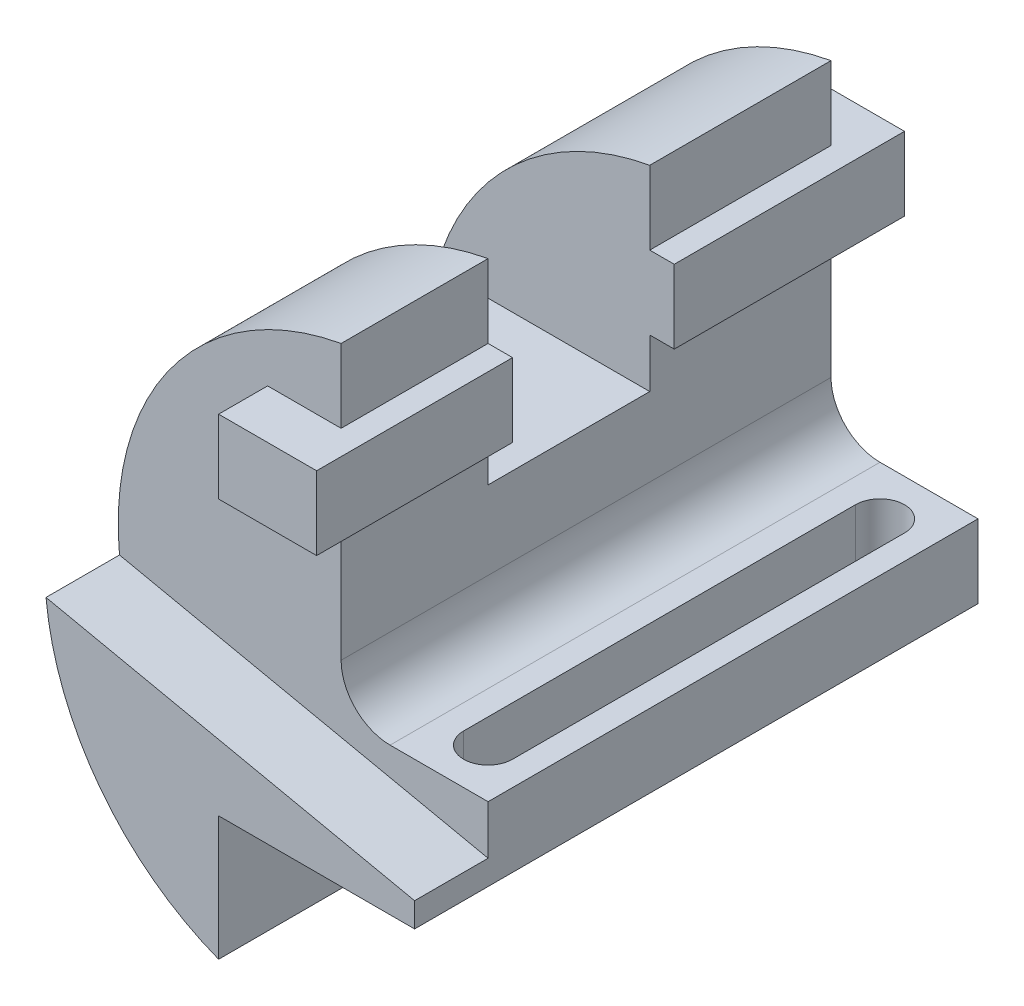
ISO-10303-21;
HEADER;
FILE_DESCRIPTION(('STEP AP214'),'2;1');
FILE_NAME('part.step','',(''),(''),'','','');
FILE_SCHEMA(('AUTOMOTIVE_DESIGN { 1 0 10303 214 1 1 1 1 }'));
ENDSEC;
DATA;
#1=APPLICATION_CONTEXT('core data for automotive mechanical design processes');
#2=APPLICATION_PROTOCOL_DEFINITION('international standard','automotive_design',2000,#1);
#3=PRODUCT_CONTEXT('',#1,'mechanical');
#4=PRODUCT('Part','Part','',(#3));
#5=PRODUCT_RELATED_PRODUCT_CATEGORY('part','',(#4));
#6=PRODUCT_DEFINITION_FORMATION('','',#4);
#7=PRODUCT_DEFINITION_CONTEXT('part definition',#1,'design');
#8=PRODUCT_DEFINITION('design','',#6,#7);
#9=PRODUCT_DEFINITION_SHAPE('','',#8);
#10=(LENGTH_UNIT() NAMED_UNIT(*) SI_UNIT(.MILLI.,.METRE.));
#11=(NAMED_UNIT(*) PLANE_ANGLE_UNIT() SI_UNIT($,.RADIAN.));
#12=(NAMED_UNIT(*) SI_UNIT($,.STERADIAN.) SOLID_ANGLE_UNIT());
#13=UNCERTAINTY_MEASURE_WITH_UNIT(LENGTH_MEASURE(1.E-05),#10,'distance_accuracy_value','');
#14=(GEOMETRIC_REPRESENTATION_CONTEXT(3) GLOBAL_UNCERTAINTY_ASSIGNED_CONTEXT((#13)) GLOBAL_UNIT_ASSIGNED_CONTEXT((#10,
#11,#12)) REPRESENTATION_CONTEXT('',''));
#15=CARTESIAN_POINT('',(0.,0.,0.));
#16=DIRECTION('',(0.,0.,1.));
#17=DIRECTION('',(1.,0.,0.));
#18=AXIS2_PLACEMENT_3D('',#15,#16,#17);
#19=CARTESIAN_POINT('',(0.,0.,100.));
#20=DIRECTION('',(0.,1.,0.));
#21=DIRECTION('',(0.,0.,1.));
#22=AXIS2_PLACEMENT_3D('',#19,#20,#21);
#23=PLANE('',#22);
#24=DIRECTION('',(1.,0.,0.));
#25=VECTOR('',#24,1.);
#26=CARTESIAN_POINT('',(0.,0.,0.));
#27=LINE('',#26,#25);
#28=CARTESIAN_POINT('',(0.,0.,0.));
#29=VERTEX_POINT('',#28);
#30=CARTESIAN_POINT('',(40.,0.,0.));
#31=VERTEX_POINT('',#30);
#32=EDGE_CURVE('E375',#29,#31,#27,.T.);
#33=ORIENTED_EDGE('',*,*,#32,.T.);
#34=DIRECTION('',(0.,0.,-1.));
#35=VECTOR('',#34,1.);
#36=CARTESIAN_POINT('',(40.,0.,100.));
#37=LINE('',#36,#35);
#38=CARTESIAN_POINT('',(40.,0.,115.));
#39=VERTEX_POINT('',#38);
#40=EDGE_CURVE('E414',#39,#31,#37,.T.);
#41=ORIENTED_EDGE('',*,*,#40,.F.);
#42=DIRECTION('',(1.,0.,0.));
#43=VECTOR('',#42,1.);
#44=CARTESIAN_POINT('',(40.,0.,115.));
#45=LINE('',#44,#43);
#46=CARTESIAN_POINT('',(0.,0.,115.));
#47=VERTEX_POINT('',#46);
#48=EDGE_CURVE('E347',#47,#39,#45,.T.);
#49=ORIENTED_EDGE('',*,*,#48,.F.);
#50=DIRECTION('',(0.,0.,-1.));
#51=VECTOR('',#50,1.);
#52=CARTESIAN_POINT('',(0.,0.,100.));
#53=LINE('',#52,#51);
#54=EDGE_CURVE('E417',#47,#29,#53,.T.);
#55=ORIENTED_EDGE('',*,*,#54,.T.);
#56=EDGE_LOOP('',(#33,#41,#49,#55));
#57=FACE_BOUND('',#56,.T.);
#58=CARTESIAN_POINT('',(30.,0.,10.));
#59=DIRECTION('',(0.,1.,0.));
#60=DIRECTION('',(0.,0.,1.));
#61=AXIS2_PLACEMENT_3D('',#58,#59,#60);
#62=CIRCLE('',#61,5.);
#63=CARTESIAN_POINT('',(25.,0.,10.));
#64=VERTEX_POINT('',#63);
#65=CARTESIAN_POINT('',(35.,0.,10.));
#66=VERTEX_POINT('',#65);
#67=EDGE_CURVE('E244',#64,#66,#62,.F.);
#68=ORIENTED_EDGE('',*,*,#67,.F.);
#69=DIRECTION('',(0.,0.,-1.));
#70=VECTOR('',#69,1.);
#71=CARTESIAN_POINT('',(25.,0.,100.));
#72=LINE('',#71,#70);
#73=CARTESIAN_POINT('',(25.,0.,90.));
#74=VERTEX_POINT('',#73);
#75=EDGE_CURVE('E242',#74,#64,#72,.T.);
#76=ORIENTED_EDGE('',*,*,#75,.F.);
#77=CARTESIAN_POINT('',(30.,0.,90.));
#78=DIRECTION('',(0.,1.,0.));
#79=DIRECTION('',(0.,0.,1.));
#80=AXIS2_PLACEMENT_3D('',#77,#78,#79);
#81=CIRCLE('',#80,4.99999999999999);
#82=CARTESIAN_POINT('',(35.,0.,90.));
#83=VERTEX_POINT('',#82);
#84=EDGE_CURVE('E229',#83,#74,#81,.F.);
#85=ORIENTED_EDGE('',*,*,#84,.F.);
#86=DIRECTION('',(0.,0.,1.));
#87=VECTOR('',#86,1.);
#88=CARTESIAN_POINT('',(35.,0.,100.));
#89=LINE('',#88,#87);
#90=EDGE_CURVE('E224',#66,#83,#89,.T.);
#91=ORIENTED_EDGE('',*,*,#90,.F.);
#92=EDGE_LOOP('',(#68,#76,#85,#91));
#93=FACE_BOUND('',#92,.T.);
#94=ADVANCED_FACE('F43',(#57,#93),#23,.F.);
#95=CARTESIAN_POINT('',(40.,15.,100.));
#96=DIRECTION('',(0.,-1.,0.));
#97=DIRECTION('',(1.,0.,0.));
#98=AXIS2_PLACEMENT_3D('',#95,#96,#97);
#99=PLANE('',#98);
#100=DIRECTION('',(-1.,0.,0.));
#101=VECTOR('',#100,1.);
#102=CARTESIAN_POINT('',(40.,15.,0.));
#103=LINE('',#102,#101);
#104=CARTESIAN_POINT('',(40.,15.,0.));
#105=VERTEX_POINT('',#104);
#106=CARTESIAN_POINT('',(20.,15.,0.));
#107=VERTEX_POINT('',#106);
#108=EDGE_CURVE('E379',#105,#107,#103,.T.);
#109=ORIENTED_EDGE('',*,*,#108,.T.);
#110=DIRECTION('',(0.,0.,-1.));
#111=VECTOR('',#110,1.);
#112=CARTESIAN_POINT('',(20.,15.,100.));
#113=LINE('',#112,#111);
#114=CARTESIAN_POINT('',(20.,15.,100.));
#115=VERTEX_POINT('',#114);
#116=EDGE_CURVE('E423',#107,#115,#113,.F.);
#117=ORIENTED_EDGE('',*,*,#116,.T.);
#118=DIRECTION('',(-1.,0.,0.));
#119=VECTOR('',#118,1.);
#120=CARTESIAN_POINT('',(40.,15.,100.));
#121=LINE('',#120,#119);
#122=CARTESIAN_POINT('',(40.,15.,100.));
#123=VERTEX_POINT('',#122);
#124=EDGE_CURVE('E361',#123,#115,#121,.T.);
#125=ORIENTED_EDGE('',*,*,#124,.F.);
#126=DIRECTION('',(0.,0.,-1.));
#127=VECTOR('',#126,1.);
#128=CARTESIAN_POINT('',(40.,15.,100.));
#129=LINE('',#128,#127);
#130=EDGE_CURVE('E411',#123,#105,#129,.T.);
#131=ORIENTED_EDGE('',*,*,#130,.T.);
#132=EDGE_LOOP('',(#109,#117,#125,#131));
#133=FACE_BOUND('',#132,.T.);
#134=CARTESIAN_POINT('',(30.,15.,10.));
#135=DIRECTION('',(0.,-1.,0.));
#136=DIRECTION('',(1.,0.,0.));
#137=AXIS2_PLACEMENT_3D('',#134,#135,#136);
#138=CIRCLE('',#137,5.);
#139=CARTESIAN_POINT('',(35.,15.,10.));
#140=VERTEX_POINT('',#139);
#141=CARTESIAN_POINT('',(25.,15.,10.));
#142=VERTEX_POINT('',#141);
#143=EDGE_CURVE('E11',#140,#142,#138,.F.);
#144=ORIENTED_EDGE('',*,*,#143,.F.);
#145=DIRECTION('',(0.,0.,-1.));
#146=VECTOR('',#145,1.);
#147=CARTESIAN_POINT('',(35.,15.,100.));
#148=LINE('',#147,#146);
#149=CARTESIAN_POINT('',(35.,15.,90.));
#150=VERTEX_POINT('',#149);
#151=EDGE_CURVE('E438',#150,#140,#148,.T.);
#152=ORIENTED_EDGE('',*,*,#151,.F.);
#153=CARTESIAN_POINT('',(30.,15.,90.));
#154=DIRECTION('',(0.,-1.,0.));
#155=DIRECTION('',(1.,0.,0.));
#156=AXIS2_PLACEMENT_3D('',#153,#154,#155);
#157=CIRCLE('',#156,4.99999999999999);
#158=CARTESIAN_POINT('',(25.,15.,90.));
#159=VERTEX_POINT('',#158);
#160=EDGE_CURVE('E237',#159,#150,#157,.F.);
#161=ORIENTED_EDGE('',*,*,#160,.F.);
#162=DIRECTION('',(0.,0.,1.));
#163=VECTOR('',#162,1.);
#164=CARTESIAN_POINT('',(25.,15.,100.));
#165=LINE('',#164,#163);
#166=EDGE_CURVE('E51',#142,#159,#165,.T.);
#167=ORIENTED_EDGE('',*,*,#166,.F.);
#168=EDGE_LOOP('',(#144,#152,#161,#167));
#169=FACE_BOUND('',#168,.T.);
#170=ADVANCED_FACE('F448',(#133,#169),#99,.F.);
#171=CARTESIAN_POINT('',(15.,51.,100.));
#172=DIRECTION('',(0.,1.,0.));
#173=DIRECTION('',(-1.,0.,0.));
#174=AXIS2_PLACEMENT_3D('',#171,#172,#173);
#175=PLANE('',#174);
#176=DIRECTION('',(0.,0.,-1.));
#177=VECTOR('',#176,1.);
#178=CARTESIAN_POINT('',(10.,51.,100.));
#179=LINE('',#178,#177);
#180=CARTESIAN_POINT('',(10.,51.,100.));
#181=VERTEX_POINT('',#180);
#182=CARTESIAN_POINT('',(10.,51.,70.));
#183=VERTEX_POINT('',#182);
#184=EDGE_CURVE('E408',#181,#183,#179,.T.);
#185=ORIENTED_EDGE('',*,*,#184,.T.);
#186=DIRECTION('',(1.,0.,0.));
#187=VECTOR('',#186,1.);
#188=CARTESIAN_POINT('',(15.,51.,70.));
#189=LINE('',#188,#187);
#190=CARTESIAN_POINT('',(15.,51.,70.));
#191=VERTEX_POINT('',#190);
#192=EDGE_CURVE('E282',#183,#191,#189,.T.);
#193=ORIENTED_EDGE('',*,*,#192,.T.);
#194=DIRECTION('',(0.,0.,-1.));
#195=VECTOR('',#194,1.);
#196=CARTESIAN_POINT('',(15.,51.,100.));
#197=LINE('',#196,#195);
#198=CARTESIAN_POINT('',(15.,51.,110.));
#199=VERTEX_POINT('',#198);
#200=EDGE_CURVE('E404',#199,#191,#197,.T.);
#201=ORIENTED_EDGE('',*,*,#200,.F.);
#202=DIRECTION('',(1.,0.,0.));
#203=VECTOR('',#202,1.);
#204=CARTESIAN_POINT('',(15.,51.,110.));
#205=LINE('',#204,#203);
#206=CARTESIAN_POINT('',(-5.,51.,110.));
#207=VERTEX_POINT('',#206);
#208=EDGE_CURVE('E297',#207,#199,#205,.T.);
#209=ORIENTED_EDGE('',*,*,#208,.F.);
#210=DIRECTION('',(0.,0.,-1.));
#211=VECTOR('',#210,1.);
#212=CARTESIAN_POINT('',(-5.,51.,110.));
#213=LINE('',#212,#211);
#214=CARTESIAN_POINT('',(-4.99999999999999,51.,100.));
#215=VERTEX_POINT('',#214);
#216=EDGE_CURVE('E300',#207,#215,#213,.T.);
#217=ORIENTED_EDGE('',*,*,#216,.T.);
#218=DIRECTION('',(1.,0.,0.));
#219=VECTOR('',#218,1.);
#220=CARTESIAN_POINT('',(15.,51.,100.));
#221=LINE('',#220,#219);
#222=EDGE_CURVE('E293',#215,#181,#221,.T.);
#223=ORIENTED_EDGE('',*,*,#222,.T.);
#224=EDGE_LOOP('',(#185,#193,#201,#209,#217,#223));
#225=FACE_BOUND('',#224,.T.);
#226=ADVANCED_FACE('F470',(#225),#175,.F.);
#227=CARTESIAN_POINT('',(15.,66.,100.));
#228=DIRECTION('',(-1.,0.,0.));
#229=DIRECTION('',(0.,-1.,0.));
#230=AXIS2_PLACEMENT_3D('',#227,#228,#229);
#231=PLANE('',#230);
#232=ORIENTED_EDGE('',*,*,#200,.T.);
#233=DIRECTION('',(0.,1.,0.));
#234=VECTOR('',#233,1.);
#235=CARTESIAN_POINT('',(15.,66.,70.));
#236=LINE('',#235,#234);
#237=CARTESIAN_POINT('',(15.,66.,70.));
#238=VERTEX_POINT('',#237);
#239=EDGE_CURVE('E279',#191,#238,#236,.T.);
#240=ORIENTED_EDGE('',*,*,#239,.T.);
#241=DIRECTION('',(0.,0.,-1.));
#242=VECTOR('',#241,1.);
#243=CARTESIAN_POINT('',(15.,66.,100.));
#244=LINE('',#243,#242);
#245=CARTESIAN_POINT('',(15.,66.,110.));
#246=VERTEX_POINT('',#245);
#247=EDGE_CURVE('E400',#246,#238,#244,.T.);
#248=ORIENTED_EDGE('',*,*,#247,.F.);
#249=DIRECTION('',(0.,1.,0.));
#250=VECTOR('',#249,1.);
#251=CARTESIAN_POINT('',(15.,66.,110.));
#252=LINE('',#251,#250);
#253=EDGE_CURVE('E289',#199,#246,#252,.T.);
#254=ORIENTED_EDGE('',*,*,#253,.F.);
#255=EDGE_LOOP('',(#232,#240,#248,#254));
#256=FACE_BOUND('',#255,.T.);
#257=ADVANCED_FACE('F553',(#256),#231,.F.);
#258=CARTESIAN_POINT('',(10.,66.,100.));
#259=DIRECTION('',(0.,-1.,0.));
#260=DIRECTION('',(1.,0.,0.));
#261=AXIS2_PLACEMENT_3D('',#258,#259,#260);
#262=PLANE('',#261);
#263=ORIENTED_EDGE('',*,*,#247,.T.);
#264=DIRECTION('',(-1.,0.,0.));
#265=VECTOR('',#264,1.);
#266=CARTESIAN_POINT('',(10.,66.,70.));
#267=LINE('',#266,#265);
#268=CARTESIAN_POINT('',(10.,66.,70.));
#269=VERTEX_POINT('',#268);
#270=EDGE_CURVE('E276',#238,#269,#267,.T.);
#271=ORIENTED_EDGE('',*,*,#270,.T.);
#272=DIRECTION('',(0.,0.,-1.));
#273=VECTOR('',#272,1.);
#274=CARTESIAN_POINT('',(10.,66.,100.));
#275=LINE('',#274,#273);
#276=CARTESIAN_POINT('',(10.,66.,100.));
#277=VERTEX_POINT('',#276);
#278=EDGE_CURVE('E396',#277,#269,#275,.T.);
#279=ORIENTED_EDGE('',*,*,#278,.F.);
#280=DIRECTION('',(1.,0.,0.));
#281=VECTOR('',#280,1.);
#282=CARTESIAN_POINT('',(20.,66.,100.));
#283=LINE('',#282,#281);
#284=CARTESIAN_POINT('',(-5.,66.,100.));
#285=VERTEX_POINT('',#284);
#286=EDGE_CURVE('E326',#285,#277,#283,.T.);
#287=ORIENTED_EDGE('',*,*,#286,.F.);
#288=DIRECTION('',(0.,0.,-1.));
#289=VECTOR('',#288,1.);
#290=CARTESIAN_POINT('',(-5.,66.,110.));
#291=LINE('',#290,#289);
#292=CARTESIAN_POINT('',(-5.,66.,110.));
#293=VERTEX_POINT('',#292);
#294=EDGE_CURVE('E305',#293,#285,#291,.T.);
#295=ORIENTED_EDGE('',*,*,#294,.F.);
#296=DIRECTION('',(-1.,0.,0.));
#297=VECTOR('',#296,1.);
#298=CARTESIAN_POINT('',(15.,66.,110.));
#299=LINE('',#298,#297);
#300=EDGE_CURVE('E292',#246,#293,#299,.T.);
#301=ORIENTED_EDGE('',*,*,#300,.F.);
#302=EDGE_LOOP('',(#263,#271,#279,#287,#295,#301));
#303=FACE_BOUND('',#302,.T.);
#304=ADVANCED_FACE('F548',(#303),#262,.F.);
#305=CARTESIAN_POINT('',(10.,66.,100.));
#306=DIRECTION('',(-1.,0.,0.));
#307=DIRECTION('',(0.,0.,1.));
#308=AXIS2_PLACEMENT_3D('',#305,#306,#307);
#309=PLANE('',#308);
#310=ORIENTED_EDGE('',*,*,#278,.T.);
#311=DIRECTION('',(0.,1.,0.));
#312=VECTOR('',#311,1.);
#313=CARTESIAN_POINT('',(10.,66.,70.));
#314=LINE('',#313,#312);
#315=CARTESIAN_POINT('',(10.,81.,70.));
#316=VERTEX_POINT('',#315);
#317=EDGE_CURVE('E273',#269,#316,#314,.T.);
#318=ORIENTED_EDGE('',*,*,#317,.T.);
#319=DIRECTION('',(0.,0.,-1.));
#320=VECTOR('',#319,1.);
#321=CARTESIAN_POINT('',(10.,81.,100.));
#322=LINE('',#321,#320);
#323=CARTESIAN_POINT('',(10.,81.,100.));
#324=VERTEX_POINT('',#323);
#325=EDGE_CURVE('E392',#324,#316,#322,.T.);
#326=ORIENTED_EDGE('',*,*,#325,.F.);
#327=DIRECTION('',(0.,1.,0.));
#328=VECTOR('',#327,1.);
#329=CARTESIAN_POINT('',(10.,66.,100.));
#330=LINE('',#329,#328);
#331=EDGE_CURVE('E368',#277,#324,#330,.T.);
#332=ORIENTED_EDGE('',*,*,#331,.F.);
#333=EDGE_LOOP('',(#310,#318,#326,#332));
#334=FACE_BOUND('',#333,.T.);
#335=ADVANCED_FACE('F486',(#334),#309,.F.);
#336=CARTESIAN_POINT('',(20.,26.4083339693685,100.));
#337=DIRECTION('',(0.,0.,1.));
#338=DIRECTION('',(1.,0.,0.));
#339=AXIS2_PLACEMENT_3D('',#336,#337,#338);
#340=PLANE('',#339);
#341=DIRECTION('',(0.,-1.,0.));
#342=VECTOR('',#341,1.);
#343=CARTESIAN_POINT('',(-5.,66.,100.));
#344=LINE('',#343,#342);
#345=EDGE_CURVE('E288',#285,#215,#344,.T.);
#346=ORIENTED_EDGE('',*,*,#345,.F.);
#347=ORIENTED_EDGE('',*,*,#286,.T.);
#348=ORIENTED_EDGE('',*,*,#331,.T.);
#349=CARTESIAN_POINT('',(20.,26.4083339693685,100.));
#350=DIRECTION('',(0.,0.,1.));
#351=DIRECTION('',(1.,0.,0.));
#352=AXIS2_PLACEMENT_3D('',#349,#350,#351);
#353=CIRCLE('',#352,55.5);
#354=CARTESIAN_POINT('',(-35.2350441418964,20.9917022998936,100.));
#355=VERTEX_POINT('',#354);
#356=EDGE_CURVE('E370',#324,#355,#353,.T.);
#357=ORIENTED_EDGE('',*,*,#356,.T.);
#358=DIRECTION('',(-0.978147600733806,0.207911690817756,0.));
#359=VECTOR('',#358,1.);
#360=CARTESIAN_POINT('',(40.,5.,100.));
#361=LINE('',#360,#359);
#362=CARTESIAN_POINT('',(40.,5.,100.));
#363=VERTEX_POINT('',#362);
#364=EDGE_CURVE('E334',#363,#355,#361,.T.);
#365=ORIENTED_EDGE('',*,*,#364,.F.);
#366=DIRECTION('',(0.,1.,0.));
#367=VECTOR('',#366,1.);
#368=CARTESIAN_POINT('',(40.,0.,100.));
#369=LINE('',#368,#367);
#370=EDGE_CURVE('E359',#363,#123,#369,.T.);
#371=ORIENTED_EDGE('',*,*,#370,.T.);
#372=ORIENTED_EDGE('',*,*,#124,.T.);
#373=CARTESIAN_POINT('',(20.,25.,100.));
#374=DIRECTION('',(0.,0.,1.));
#375=DIRECTION('',(1.,0.,0.));
#376=AXIS2_PLACEMENT_3D('',#373,#374,#375);
#377=CIRCLE('',#376,10.);
#378=CARTESIAN_POINT('',(10.,25.,100.));
#379=VERTEX_POINT('',#378);
#380=EDGE_CURVE('E327',#115,#379,#377,.F.);
#381=ORIENTED_EDGE('',*,*,#380,.T.);
#382=DIRECTION('',(0.,1.,0.));
#383=VECTOR('',#382,1.);
#384=CARTESIAN_POINT('',(10.,15.,100.));
#385=LINE('',#384,#383);
#386=EDGE_CURVE('E365',#379,#181,#385,.T.);
#387=ORIENTED_EDGE('',*,*,#386,.T.);
#388=ORIENTED_EDGE('',*,*,#222,.F.);
#389=EDGE_LOOP('',(#346,#347,#348,#357,#365,#371,#372,#381,#387,#388));
#390=FACE_BOUND('',#389,.T.);
#391=ADVANCED_FACE('F477',(#390),#340,.T.);
#392=CARTESIAN_POINT('',(0.,0.,100.));
#393=DIRECTION('',(-1.,0.,0.));
#394=DIRECTION('',(0.,-1.,0.));
#395=AXIS2_PLACEMENT_3D('',#392,#393,#394);
#396=PLANE('',#395);
#397=DIRECTION('',(0.,1.,0.));
#398=VECTOR('',#397,1.);
#399=CARTESIAN_POINT('',(0.,0.,0.));
#400=LINE('',#399,#398);
#401=CARTESIAN_POINT('',(0.,-25.3627969821569,0.));
#402=VERTEX_POINT('',#401);
#403=EDGE_CURVE('E358',#402,#29,#400,.T.);
#404=ORIENTED_EDGE('',*,*,#403,.T.);
#405=ORIENTED_EDGE('',*,*,#54,.F.);
#406=DIRECTION('',(0.,1.,0.));
#407=VECTOR('',#406,1.);
#408=CARTESIAN_POINT('',(0.,0.,115.));
#409=LINE('',#408,#407);
#410=CARTESIAN_POINT('',(0.,-25.3627969821569,115.));
#411=VERTEX_POINT('',#410);
#412=EDGE_CURVE('E344',#411,#47,#409,.T.);
#413=ORIENTED_EDGE('',*,*,#412,.F.);
#414=DIRECTION('',(0.,0.,-1.));
#415=VECTOR('',#414,1.);
#416=CARTESIAN_POINT('',(0.,-25.3627969821569,100.));
#417=LINE('',#416,#415);
#418=EDGE_CURVE('E372',#411,#402,#417,.T.);
#419=ORIENTED_EDGE('',*,*,#418,.T.);
#420=EDGE_LOOP('',(#404,#405,#413,#419));
#421=FACE_BOUND('',#420,.T.);
#422=ADVANCED_FACE('F475',(#421),#396,.F.);
#423=CARTESIAN_POINT('',(40.,0.,100.));
#424=DIRECTION('',(-1.,0.,0.));
#425=DIRECTION('',(0.,0.,1.));
#426=AXIS2_PLACEMENT_3D('',#423,#424,#425);
#427=PLANE('',#426);
#428=DIRECTION('',(0.,1.,0.));
#429=VECTOR('',#428,1.);
#430=CARTESIAN_POINT('',(40.,0.,0.));
#431=LINE('',#430,#429);
#432=EDGE_CURVE('E377',#31,#105,#431,.T.);
#433=ORIENTED_EDGE('',*,*,#432,.T.);
#434=ORIENTED_EDGE('',*,*,#130,.F.);
#435=ORIENTED_EDGE('',*,*,#370,.F.);
#436=DIRECTION('',(0.,0.,-1.));
#437=VECTOR('',#436,1.);
#438=CARTESIAN_POINT('',(40.,5.,115.));
#439=LINE('',#438,#437);
#440=CARTESIAN_POINT('',(40.,5.,115.));
#441=VERTEX_POINT('',#440);
#442=EDGE_CURVE('E355',#441,#363,#439,.T.);
#443=ORIENTED_EDGE('',*,*,#442,.F.);
#444=DIRECTION('',(0.,1.,0.));
#445=VECTOR('',#444,1.);
#446=CARTESIAN_POINT('',(40.,5.,115.));
#447=LINE('',#446,#445);
#448=EDGE_CURVE('E336',#39,#441,#447,.T.);
#449=ORIENTED_EDGE('',*,*,#448,.F.);
#450=ORIENTED_EDGE('',*,*,#40,.T.);
#451=EDGE_LOOP('',(#433,#434,#435,#443,#449,#450));
#452=FACE_BOUND('',#451,.T.);
#453=ADVANCED_FACE('F474',(#452),#427,.F.);
#454=CARTESIAN_POINT('',(10.,15.,100.));
#455=DIRECTION('',(-1.,0.,0.));
#456=DIRECTION('',(0.,0.,1.));
#457=AXIS2_PLACEMENT_3D('',#454,#455,#456);
#458=PLANE('',#457);
#459=DIRECTION('',(0.,0.,1.));
#460=VECTOR('',#459,1.);
#461=CARTESIAN_POINT('',(10.,41.,100.));
#462=LINE('',#461,#460);
#463=CARTESIAN_POINT('',(10.,41.,37.));
#464=VERTEX_POINT('',#463);
#465=CARTESIAN_POINT('',(10.,41.,70.));
#466=VERTEX_POINT('',#465);
#467=EDGE_CURVE('E253',#464,#466,#462,.T.);
#468=ORIENTED_EDGE('',*,*,#467,.T.);
#469=DIRECTION('',(0.,1.,0.));
#470=VECTOR('',#469,1.);
#471=CARTESIAN_POINT('',(10.,15.,70.));
#472=LINE('',#471,#470);
#473=EDGE_CURVE('E285',#466,#183,#472,.T.);
#474=ORIENTED_EDGE('',*,*,#473,.T.);
#475=ORIENTED_EDGE('',*,*,#184,.F.);
#476=ORIENTED_EDGE('',*,*,#386,.F.);
#477=DIRECTION('',(0.,0.,-1.));
#478=VECTOR('',#477,1.);
#479=CARTESIAN_POINT('',(10.,25.,0.));
#480=LINE('',#479,#478);
#481=CARTESIAN_POINT('',(10.,25.,0.));
#482=VERTEX_POINT('',#481);
#483=EDGE_CURVE('E420',#379,#482,#480,.T.);
#484=ORIENTED_EDGE('',*,*,#483,.T.);
#485=DIRECTION('',(0.,1.,0.));
#486=VECTOR('',#485,1.);
#487=CARTESIAN_POINT('',(10.,15.,0.));
#488=LINE('',#487,#486);
#489=CARTESIAN_POINT('',(10.,51.,0.));
#490=VERTEX_POINT('',#489);
#491=EDGE_CURVE('E382',#482,#490,#488,.T.);
#492=ORIENTED_EDGE('',*,*,#491,.T.);
#493=CARTESIAN_POINT('',(10.,51.,37.));
#494=VERTEX_POINT('',#493);
#495=EDGE_CURVE('E407',#494,#490,#179,.T.);
#496=ORIENTED_EDGE('',*,*,#495,.F.);
#497=DIRECTION('',(0.,-1.,0.));
#498=VECTOR('',#497,1.);
#499=CARTESIAN_POINT('',(10.,15.,37.));
#500=LINE('',#499,#498);
#501=EDGE_CURVE('E270',#494,#464,#500,.T.);
#502=ORIENTED_EDGE('',*,*,#501,.T.);
#503=EDGE_LOOP('',(#468,#474,#475,#476,#484,#492,#496,#502));
#504=FACE_BOUND('',#503,.T.);
#505=ADVANCED_FACE('F483',(#504),#458,.F.);
#506=CARTESIAN_POINT('',(15.,51.,37.));
#507=VERTEX_POINT('',#506);
#508=CARTESIAN_POINT('',(15.,51.,-10.));
#509=VERTEX_POINT('',#508);
#510=EDGE_CURVE('E403',#507,#509,#197,.T.);
#511=ORIENTED_EDGE('',*,*,#510,.F.);
#512=DIRECTION('',(-1.,0.,0.));
#513=VECTOR('',#512,1.);
#514=CARTESIAN_POINT('',(15.,51.,37.));
#515=LINE('',#514,#513);
#516=EDGE_CURVE('E267',#507,#494,#515,.T.);
#517=ORIENTED_EDGE('',*,*,#516,.T.);
#518=ORIENTED_EDGE('',*,*,#495,.T.);
#519=DIRECTION('',(1.,0.,0.));
#520=VECTOR('',#519,1.);
#521=CARTESIAN_POINT('',(15.,51.,0.));
#522=LINE('',#521,#520);
#523=CARTESIAN_POINT('',(-5.,51.,0.));
#524=VERTEX_POINT('',#523);
#525=EDGE_CURVE('E313',#524,#490,#522,.T.);
#526=ORIENTED_EDGE('',*,*,#525,.F.);
#527=DIRECTION('',(0.,0.,1.));
#528=VECTOR('',#527,1.);
#529=CARTESIAN_POINT('',(-5.,51.,-10.));
#530=LINE('',#529,#528);
#531=CARTESIAN_POINT('',(-5.,51.,-10.));
#532=VERTEX_POINT('',#531);
#533=EDGE_CURVE('E332',#532,#524,#530,.T.);
#534=ORIENTED_EDGE('',*,*,#533,.F.);
#535=DIRECTION('',(1.,0.,0.));
#536=VECTOR('',#535,1.);
#537=CARTESIAN_POINT('',(15.,51.,-10.));
#538=LINE('',#537,#536);
#539=EDGE_CURVE('E319',#532,#509,#538,.T.);
#540=ORIENTED_EDGE('',*,*,#539,.T.);
#541=EDGE_LOOP('',(#511,#517,#518,#526,#534,#540));
#542=FACE_BOUND('',#541,.T.);
#543=ADVANCED_FACE('F528',(#542),#175,.F.);
#544=CARTESIAN_POINT('',(15.,66.,37.));
#545=VERTEX_POINT('',#544);
#546=CARTESIAN_POINT('',(15.,66.,-10.));
#547=VERTEX_POINT('',#546);
#548=EDGE_CURVE('E399',#545,#547,#244,.T.);
#549=ORIENTED_EDGE('',*,*,#548,.F.);
#550=DIRECTION('',(0.,-1.,0.));
#551=VECTOR('',#550,1.);
#552=CARTESIAN_POINT('',(15.,66.,37.));
#553=LINE('',#552,#551);
#554=EDGE_CURVE('E264',#545,#507,#553,.T.);
#555=ORIENTED_EDGE('',*,*,#554,.T.);
#556=ORIENTED_EDGE('',*,*,#510,.T.);
#557=DIRECTION('',(0.,1.,0.));
#558=VECTOR('',#557,1.);
#559=CARTESIAN_POINT('',(15.,66.,-10.));
#560=LINE('',#559,#558);
#561=EDGE_CURVE('E309',#509,#547,#560,.T.);
#562=ORIENTED_EDGE('',*,*,#561,.T.);
#563=EDGE_LOOP('',(#549,#555,#556,#562));
#564=FACE_BOUND('',#563,.T.);
#565=ADVANCED_FACE('F560',(#564),#231,.F.);
#566=CARTESIAN_POINT('',(10.,66.,37.));
#567=VERTEX_POINT('',#566);
#568=CARTESIAN_POINT('',(10.,66.,0.));
#569=VERTEX_POINT('',#568);
#570=EDGE_CURVE('E395',#567,#569,#275,.T.);
#571=ORIENTED_EDGE('',*,*,#570,.F.);
#572=DIRECTION('',(1.,0.,0.));
#573=VECTOR('',#572,1.);
#574=CARTESIAN_POINT('',(10.,66.,37.));
#575=LINE('',#574,#573);
#576=EDGE_CURVE('E261',#567,#545,#575,.T.);
#577=ORIENTED_EDGE('',*,*,#576,.T.);
#578=ORIENTED_EDGE('',*,*,#548,.T.);
#579=DIRECTION('',(-1.,0.,0.));
#580=VECTOR('',#579,1.);
#581=CARTESIAN_POINT('',(15.,66.,-10.));
#582=LINE('',#581,#580);
#583=CARTESIAN_POINT('',(-5.,66.,-10.));
#584=VERTEX_POINT('',#583);
#585=EDGE_CURVE('E312',#547,#584,#582,.T.);
#586=ORIENTED_EDGE('',*,*,#585,.T.);
#587=DIRECTION('',(0.,0.,1.));
#588=VECTOR('',#587,1.);
#589=CARTESIAN_POINT('',(-5.,66.,-10.));
#590=LINE('',#589,#588);
#591=CARTESIAN_POINT('',(-5.,66.,0.));
#592=VERTEX_POINT('',#591);
#593=EDGE_CURVE('E322',#584,#592,#590,.T.);
#594=ORIENTED_EDGE('',*,*,#593,.T.);
#595=DIRECTION('',(-1.,0.,0.));
#596=VECTOR('',#595,1.);
#597=CARTESIAN_POINT('',(15.,66.,0.));
#598=LINE('',#597,#596);
#599=EDGE_CURVE('E323',#569,#592,#598,.T.);
#600=ORIENTED_EDGE('',*,*,#599,.F.);
#601=EDGE_LOOP('',(#571,#577,#578,#586,#594,#600));
#602=FACE_BOUND('',#601,.T.);
#603=ADVANCED_FACE('F519',(#602),#262,.F.);
#604=CARTESIAN_POINT('',(10.,81.,37.));
#605=VERTEX_POINT('',#604);
#606=CARTESIAN_POINT('',(10.,81.,0.));
#607=VERTEX_POINT('',#606);
#608=EDGE_CURVE('E391',#605,#607,#322,.T.);
#609=ORIENTED_EDGE('',*,*,#608,.F.);
#610=DIRECTION('',(0.,-1.,0.));
#611=VECTOR('',#610,1.);
#612=CARTESIAN_POINT('',(10.,66.,37.));
#613=LINE('',#612,#611);
#614=EDGE_CURVE('E258',#605,#567,#613,.T.);
#615=ORIENTED_EDGE('',*,*,#614,.T.);
#616=ORIENTED_EDGE('',*,*,#570,.T.);
#617=DIRECTION('',(0.,1.,0.));
#618=VECTOR('',#617,1.);
#619=CARTESIAN_POINT('',(10.,66.,0.));
#620=LINE('',#619,#618);
#621=EDGE_CURVE('E385',#569,#607,#620,.T.);
#622=ORIENTED_EDGE('',*,*,#621,.T.);
#623=EDGE_LOOP('',(#609,#615,#616,#622));
#624=FACE_BOUND('',#623,.T.);
#625=ADVANCED_FACE('F514',(#624),#309,.F.);
#626=CARTESIAN_POINT('',(20.,26.4083339693685,100.));
#627=DIRECTION('',(0.,0.,-1.));
#628=DIRECTION('',(-1.,0.,0.));
#629=AXIS2_PLACEMENT_3D('',#626,#627,#628);
#630=CYLINDRICAL_SURFACE('',#629,55.5);
#631=ORIENTED_EDGE('',*,*,#325,.T.);
#632=CARTESIAN_POINT('',(20.,26.4083339693685,70.));
#633=DIRECTION('',(0.,0.,1.));
#634=DIRECTION('',(1.,0.,0.));
#635=AXIS2_PLACEMENT_3D('',#632,#633,#634);
#636=CIRCLE('',#635,55.5);
#637=CARTESIAN_POINT('',(-33.5474862383895,41.,70.));
#638=VERTEX_POINT('',#637);
#639=EDGE_CURVE('E435',#316,#638,#636,.T.);
#640=ORIENTED_EDGE('',*,*,#639,.T.);
#641=DIRECTION('',(0.,0.,-1.));
#642=VECTOR('',#641,1.);
#643=CARTESIAN_POINT('',(-33.5474862383895,41.,100.));
#644=LINE('',#643,#642);
#645=CARTESIAN_POINT('',(-33.5474862383895,41.,37.));
#646=VERTEX_POINT('',#645);
#647=EDGE_CURVE('E429',#638,#646,#644,.T.);
#648=ORIENTED_EDGE('',*,*,#647,.T.);
#649=CARTESIAN_POINT('',(20.,26.4083339693685,37.));
#650=DIRECTION('',(0.,0.,-1.));
#651=DIRECTION('',(0.,1.,0.));
#652=AXIS2_PLACEMENT_3D('',#649,#650,#651);
#653=CIRCLE('',#652,55.5);
#654=EDGE_CURVE('E432',#646,#605,#653,.T.);
#655=ORIENTED_EDGE('',*,*,#654,.T.);
#656=ORIENTED_EDGE('',*,*,#608,.T.);
#657=CARTESIAN_POINT('',(20.,26.4083339693685,0.));
#658=DIRECTION('',(0.,0.,1.));
#659=DIRECTION('',(1.,0.,0.));
#660=AXIS2_PLACEMENT_3D('',#657,#658,#659);
#661=CIRCLE('',#660,55.5);
#662=EDGE_CURVE('E362',#607,#402,#661,.T.);
#663=ORIENTED_EDGE('',*,*,#662,.T.);
#664=ORIENTED_EDGE('',*,*,#418,.F.);
#665=CARTESIAN_POINT('',(20.0000000000001,26.4083339693686,115.));
#666=DIRECTION('',(0.,0.,1.));
#667=DIRECTION('',(1.,0.,0.));
#668=AXIS2_PLACEMENT_3D('',#665,#666,#667);
#669=CIRCLE('',#668,55.5000000000001);
#670=CARTESIAN_POINT('',(-35.2350441418964,20.9917022998936,115.));
#671=VERTEX_POINT('',#670);
#672=EDGE_CURVE('E341',#671,#411,#669,.T.);
#673=ORIENTED_EDGE('',*,*,#672,.F.);
#674=DIRECTION('',(0.,0.,-1.));
#675=VECTOR('',#674,1.);
#676=CARTESIAN_POINT('',(-35.2350441418964,20.9917022998936,115.));
#677=LINE('',#676,#675);
#678=EDGE_CURVE('E350',#671,#355,#677,.T.);
#679=ORIENTED_EDGE('',*,*,#678,.T.);
#680=ORIENTED_EDGE('',*,*,#356,.F.);
#681=EDGE_LOOP('',(#631,#640,#648,#655,#656,#663,#664,#673,#679,#680));
#682=FACE_BOUND('',#681,.T.);
#683=ADVANCED_FACE('F509',(#682),#630,.T.);
#684=CARTESIAN_POINT('',(20.,26.4083339693685,0.));
#685=DIRECTION('',(0.,0.,1.));
#686=DIRECTION('',(1.,0.,0.));
#687=AXIS2_PLACEMENT_3D('',#684,#685,#686);
#688=PLANE('',#687);
#689=ORIENTED_EDGE('',*,*,#621,.F.);
#690=ORIENTED_EDGE('',*,*,#599,.T.);
#691=DIRECTION('',(0.,-1.,0.));
#692=VECTOR('',#691,1.);
#693=CARTESIAN_POINT('',(-5.,66.,0.));
#694=LINE('',#693,#692);
#695=EDGE_CURVE('E308',#592,#524,#694,.T.);
#696=ORIENTED_EDGE('',*,*,#695,.T.);
#697=ORIENTED_EDGE('',*,*,#525,.T.);
#698=ORIENTED_EDGE('',*,*,#491,.F.);
#699=CARTESIAN_POINT('',(20.,25.,0.));
#700=DIRECTION('',(0.,0.,1.));
#701=DIRECTION('',(1.,0.,0.));
#702=AXIS2_PLACEMENT_3D('',#699,#700,#701);
#703=CIRCLE('',#702,10.);
#704=EDGE_CURVE('E425',#482,#107,#703,.T.);
#705=ORIENTED_EDGE('',*,*,#704,.T.);
#706=ORIENTED_EDGE('',*,*,#108,.F.);
#707=ORIENTED_EDGE('',*,*,#432,.F.);
#708=ORIENTED_EDGE('',*,*,#32,.F.);
#709=ORIENTED_EDGE('',*,*,#403,.F.);
#710=ORIENTED_EDGE('',*,*,#662,.F.);
#711=EDGE_LOOP('',(#689,#690,#696,#697,#698,#705,#706,#707,#708,#709,#710));
#712=FACE_BOUND('',#711,.T.);
#713=ADVANCED_FACE('F494',(#712),#688,.F.);
#714=CARTESIAN_POINT('',(20.,25.,100.));
#715=DIRECTION('',(0.,0.,1.));
#716=DIRECTION('',(1.,0.,0.));
#717=AXIS2_PLACEMENT_3D('',#714,#715,#716);
#718=CYLINDRICAL_SURFACE('',#717,10.);
#719=ORIENTED_EDGE('',*,*,#380,.F.);
#720=ORIENTED_EDGE('',*,*,#116,.F.);
#721=ORIENTED_EDGE('',*,*,#704,.F.);
#722=ORIENTED_EDGE('',*,*,#483,.F.);
#723=EDGE_LOOP('',(#719,#720,#721,#722));
#724=FACE_BOUND('',#723,.T.);
#725=ADVANCED_FACE('F45',(#724),#718,.F.);
#726=CARTESIAN_POINT('',(40.,5.,115.));
#727=DIRECTION('',(-0.207911690817756,-0.978147600733806,0.));
#728=DIRECTION('',(0.978147600733806,-0.207911690817756,0.));
#729=AXIS2_PLACEMENT_3D('',#726,#727,#728);
#730=PLANE('',#729);
#731=ORIENTED_EDGE('',*,*,#364,.T.);
#732=ORIENTED_EDGE('',*,*,#678,.F.);
#733=DIRECTION('',(-0.978147600733806,0.207911690817756,0.));
#734=VECTOR('',#733,1.);
#735=CARTESIAN_POINT('',(40.,5.,115.));
#736=LINE('',#735,#734);
#737=EDGE_CURVE('E339',#441,#671,#736,.T.);
#738=ORIENTED_EDGE('',*,*,#737,.F.);
#739=ORIENTED_EDGE('',*,*,#442,.T.);
#740=EDGE_LOOP('',(#731,#732,#738,#739));
#741=FACE_BOUND('',#740,.T.);
#742=ADVANCED_FACE('F505',(#741),#730,.F.);
#743=CARTESIAN_POINT('',(20.0000000000001,26.4083339693686,115.));
#744=DIRECTION('',(0.,0.,1.));
#745=DIRECTION('',(1.,0.,0.));
#746=AXIS2_PLACEMENT_3D('',#743,#744,#745);
#747=PLANE('',#746);
#748=ORIENTED_EDGE('',*,*,#448,.T.);
#749=ORIENTED_EDGE('',*,*,#737,.T.);
#750=ORIENTED_EDGE('',*,*,#672,.T.);
#751=ORIENTED_EDGE('',*,*,#412,.T.);
#752=ORIENTED_EDGE('',*,*,#48,.T.);
#753=EDGE_LOOP('',(#748,#749,#750,#751,#752));
#754=FACE_BOUND('',#753,.T.);
#755=ADVANCED_FACE('F500',(#754),#747,.T.);
#756=CARTESIAN_POINT('',(-5.,66.,-10.));
#757=DIRECTION('',(-1.,0.,0.));
#758=DIRECTION('',(0.,-1.,0.));
#759=AXIS2_PLACEMENT_3D('',#756,#757,#758);
#760=PLANE('',#759);
#761=ORIENTED_EDGE('',*,*,#695,.F.);
#762=ORIENTED_EDGE('',*,*,#593,.F.);
#763=DIRECTION('',(0.,-1.,0.));
#764=VECTOR('',#763,1.);
#765=CARTESIAN_POINT('',(-5.,66.,-10.));
#766=LINE('',#765,#764);
#767=EDGE_CURVE('E316',#584,#532,#766,.T.);
#768=ORIENTED_EDGE('',*,*,#767,.T.);
#769=ORIENTED_EDGE('',*,*,#533,.T.);
#770=EDGE_LOOP('',(#761,#762,#768,#769));
#771=FACE_BOUND('',#770,.T.);
#772=ADVANCED_FACE('F523',(#771),#760,.T.);
#773=CARTESIAN_POINT('',(0.,0.,-10.));
#774=DIRECTION('',(0.,0.,-1.));
#775=DIRECTION('',(-1.,0.,0.));
#776=AXIS2_PLACEMENT_3D('',#773,#774,#775);
#777=PLANE('',#776);
#778=ORIENTED_EDGE('',*,*,#561,.F.);
#779=ORIENTED_EDGE('',*,*,#539,.F.);
#780=ORIENTED_EDGE('',*,*,#767,.F.);
#781=ORIENTED_EDGE('',*,*,#585,.F.);
#782=EDGE_LOOP('',(#778,#779,#780,#781));
#783=FACE_BOUND('',#782,.T.);
#784=ADVANCED_FACE('F563',(#783),#777,.T.);
#785=CARTESIAN_POINT('',(-5.,66.,110.));
#786=DIRECTION('',(1.,0.,0.));
#787=DIRECTION('',(0.,1.,0.));
#788=AXIS2_PLACEMENT_3D('',#785,#786,#787);
#789=PLANE('',#788);
#790=ORIENTED_EDGE('',*,*,#345,.T.);
#791=ORIENTED_EDGE('',*,*,#216,.F.);
#792=DIRECTION('',(0.,-1.,0.));
#793=VECTOR('',#792,1.);
#794=CARTESIAN_POINT('',(-5.,66.,110.));
#795=LINE('',#794,#793);
#796=EDGE_CURVE('E295',#293,#207,#795,.T.);
#797=ORIENTED_EDGE('',*,*,#796,.F.);
#798=ORIENTED_EDGE('',*,*,#294,.T.);
#799=EDGE_LOOP('',(#790,#791,#797,#798));
#800=FACE_BOUND('',#799,.T.);
#801=ADVANCED_FACE('F565',(#800),#789,.F.);
#802=CARTESIAN_POINT('',(0.,0.,110.));
#803=DIRECTION('',(0.,0.,-1.));
#804=DIRECTION('',(-1.,0.,0.));
#805=AXIS2_PLACEMENT_3D('',#802,#803,#804);
#806=PLANE('',#805);
#807=ORIENTED_EDGE('',*,*,#253,.T.);
#808=ORIENTED_EDGE('',*,*,#300,.T.);
#809=ORIENTED_EDGE('',*,*,#796,.T.);
#810=ORIENTED_EDGE('',*,*,#208,.T.);
#811=EDGE_LOOP('',(#807,#808,#809,#810));
#812=FACE_BOUND('',#811,.T.);
#813=ADVANCED_FACE('F571',(#812),#806,.F.);
#814=CARTESIAN_POINT('',(-35.5,81.,70.));
#815=DIRECTION('',(0.,0.,1.));
#816=DIRECTION('',(1.,0.,0.));
#817=AXIS2_PLACEMENT_3D('',#814,#815,#816);
#818=PLANE('',#817);
#819=DIRECTION('',(1.,0.,0.));
#820=VECTOR('',#819,1.);
#821=CARTESIAN_POINT('',(-35.5,41.,70.));
#822=LINE('',#821,#820);
#823=EDGE_CURVE('E249',#638,#466,#822,.T.);
#824=ORIENTED_EDGE('',*,*,#823,.F.);
#825=ORIENTED_EDGE('',*,*,#639,.F.);
#826=ORIENTED_EDGE('',*,*,#317,.F.);
#827=ORIENTED_EDGE('',*,*,#270,.F.);
#828=ORIENTED_EDGE('',*,*,#239,.F.);
#829=ORIENTED_EDGE('',*,*,#192,.F.);
#830=ORIENTED_EDGE('',*,*,#473,.F.);
#831=EDGE_LOOP('',(#824,#825,#826,#827,#828,#829,#830));
#832=FACE_BOUND('',#831,.T.);
#833=ADVANCED_FACE('F546',(#832),#818,.F.);
#834=CARTESIAN_POINT('',(-35.5,81.,37.));
#835=DIRECTION('',(0.,0.,-1.));
#836=DIRECTION('',(0.,1.,0.));
#837=AXIS2_PLACEMENT_3D('',#834,#835,#836);
#838=PLANE('',#837);
#839=ORIENTED_EDGE('',*,*,#516,.F.);
#840=ORIENTED_EDGE('',*,*,#554,.F.);
#841=ORIENTED_EDGE('',*,*,#576,.F.);
#842=ORIENTED_EDGE('',*,*,#614,.F.);
#843=ORIENTED_EDGE('',*,*,#654,.F.);
#844=DIRECTION('',(1.,0.,0.));
#845=VECTOR('',#844,1.);
#846=CARTESIAN_POINT('',(-35.5,41.,37.));
#847=LINE('',#846,#845);
#848=EDGE_CURVE('E250',#646,#464,#847,.T.);
#849=ORIENTED_EDGE('',*,*,#848,.T.);
#850=ORIENTED_EDGE('',*,*,#501,.F.);
#851=EDGE_LOOP('',(#839,#840,#841,#842,#843,#849,#850));
#852=FACE_BOUND('',#851,.T.);
#853=ADVANCED_FACE('F461',(#852),#838,.F.);
#854=CARTESIAN_POINT('',(-35.5,41.,70.));
#855=DIRECTION('',(0.,-1.,0.));
#856=DIRECTION('',(0.,0.,-1.));
#857=AXIS2_PLACEMENT_3D('',#854,#855,#856);
#858=PLANE('',#857);
#859=ORIENTED_EDGE('',*,*,#848,.F.);
#860=ORIENTED_EDGE('',*,*,#647,.F.);
#861=ORIENTED_EDGE('',*,*,#823,.T.);
#862=ORIENTED_EDGE('',*,*,#467,.F.);
#863=EDGE_LOOP('',(#859,#860,#861,#862));
#864=FACE_BOUND('',#863,.T.);
#865=ADVANCED_FACE('F453',(#864),#858,.F.);
#866=CARTESIAN_POINT('',(30.,81.,10.));
#867=DIRECTION('',(0.,-1.,0.));
#868=DIRECTION('',(0.,0.,-1.));
#869=AXIS2_PLACEMENT_3D('',#866,#867,#868);
#870=CYLINDRICAL_SURFACE('',#869,5.);
#871=ORIENTED_EDGE('',*,*,#67,.T.);
#872=DIRECTION('',(0.,-1.,0.));
#873=VECTOR('',#872,1.);
#874=CARTESIAN_POINT('',(35.,81.,10.));
#875=LINE('',#874,#873);
#876=EDGE_CURVE('E58',#140,#66,#875,.T.);
#877=ORIENTED_EDGE('',*,*,#876,.F.);
#878=ORIENTED_EDGE('',*,*,#143,.T.);
#879=DIRECTION('',(0.,-1.,0.));
#880=VECTOR('',#879,1.);
#881=CARTESIAN_POINT('',(25.,81.,10.));
#882=LINE('',#881,#880);
#883=EDGE_CURVE('E230',#142,#64,#882,.T.);
#884=ORIENTED_EDGE('',*,*,#883,.T.);
#885=EDGE_LOOP('',(#871,#877,#878,#884));
#886=FACE_BOUND('',#885,.T.);
#887=ADVANCED_FACE('F450',(#886),#870,.F.);
#888=CARTESIAN_POINT('',(25.,81.,10.));
#889=DIRECTION('',(1.,0.,0.));
#890=DIRECTION('',(0.,0.,-1.));
#891=AXIS2_PLACEMENT_3D('',#888,#889,#890);
#892=PLANE('',#891);
#893=ORIENTED_EDGE('',*,*,#75,.T.);
#894=ORIENTED_EDGE('',*,*,#883,.F.);
#895=ORIENTED_EDGE('',*,*,#166,.T.);
#896=DIRECTION('',(0.,-1.,0.));
#897=VECTOR('',#896,1.);
#898=CARTESIAN_POINT('',(25.,81.,90.));
#899=LINE('',#898,#897);
#900=EDGE_CURVE('E239',#159,#74,#899,.T.);
#901=ORIENTED_EDGE('',*,*,#900,.T.);
#902=EDGE_LOOP('',(#893,#894,#895,#901));
#903=FACE_BOUND('',#902,.T.);
#904=ADVANCED_FACE('F443',(#903),#892,.T.);
#905=CARTESIAN_POINT('',(30.,81.,90.));
#906=DIRECTION('',(0.,-1.,0.));
#907=DIRECTION('',(0.,0.,-1.));
#908=AXIS2_PLACEMENT_3D('',#905,#906,#907);
#909=CYLINDRICAL_SURFACE('',#908,4.99999999999999);
#910=ORIENTED_EDGE('',*,*,#84,.T.);
#911=ORIENTED_EDGE('',*,*,#900,.F.);
#912=ORIENTED_EDGE('',*,*,#160,.T.);
#913=DIRECTION('',(0.,-1.,0.));
#914=VECTOR('',#913,1.);
#915=CARTESIAN_POINT('',(35.,81.,90.));
#916=LINE('',#915,#914);
#917=EDGE_CURVE('E63',#150,#83,#916,.T.);
#918=ORIENTED_EDGE('',*,*,#917,.T.);
#919=EDGE_LOOP('',(#910,#911,#912,#918));
#920=FACE_BOUND('',#919,.T.);
#921=ADVANCED_FACE('F233',(#920),#909,.F.);
#922=CARTESIAN_POINT('',(35.,81.,10.));
#923=DIRECTION('',(-1.,0.,0.));
#924=DIRECTION('',(0.,0.,1.));
#925=AXIS2_PLACEMENT_3D('',#922,#923,#924);
#926=PLANE('',#925);
#927=ORIENTED_EDGE('',*,*,#90,.T.);
#928=ORIENTED_EDGE('',*,*,#917,.F.);
#929=ORIENTED_EDGE('',*,*,#151,.T.);
#930=ORIENTED_EDGE('',*,*,#876,.T.);
#931=EDGE_LOOP('',(#927,#928,#929,#930));
#932=FACE_BOUND('',#931,.T.);
#933=ADVANCED_FACE('F225',(#932),#926,.T.);
#934=CLOSED_SHELL('',(#94,#170,#226,#257,#304,#335,#391,#422,#453,#505,#543,#565,#603,#625,#683,
#713,#725,#742,#755,#772,#784,#801,#813,#833,#853,#865,#887,#904,#921,#933));
#935=MANIFOLD_SOLID_BREP('B2',#934);
#936=ADVANCED_BREP_SHAPE_REPRESENTATION('',(#18,#935),#14);
#937=SHAPE_DEFINITION_REPRESENTATION(#9,#936);
ENDSEC;
END-ISO-10303-21;
